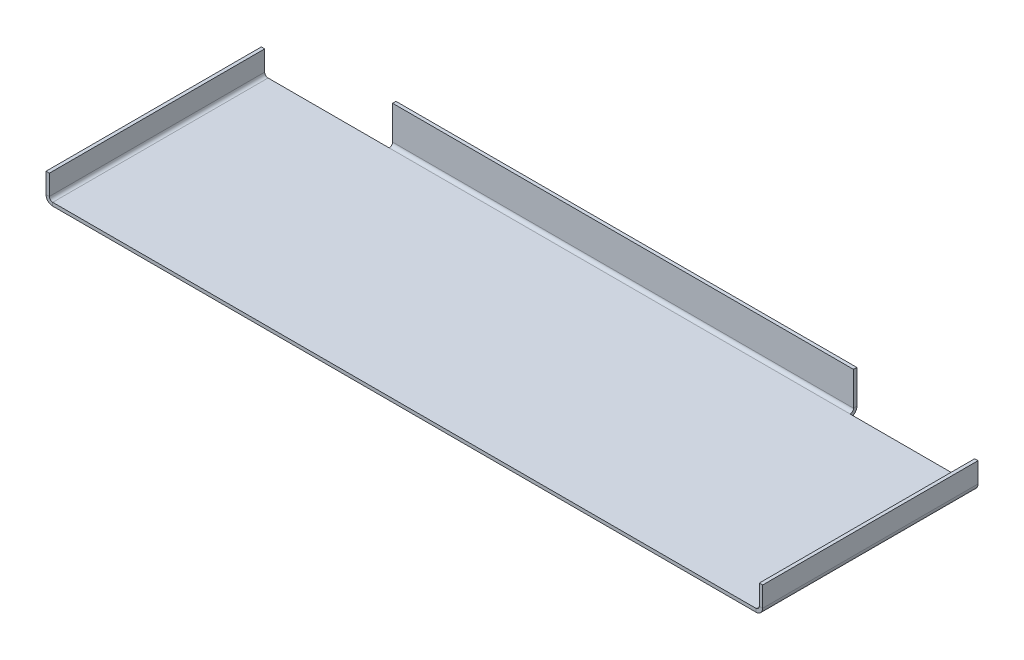
ISO-10303-21;
HEADER;
FILE_DESCRIPTION(('STEP AP214'),'2;1');
FILE_NAME('part.step','',(''),(''),'','','');
FILE_SCHEMA(('AUTOMOTIVE_DESIGN { 1 0 10303 214 1 1 1 1 }'));
ENDSEC;
DATA;
#1=APPLICATION_CONTEXT('core data for automotive mechanical design processes');
#2=APPLICATION_PROTOCOL_DEFINITION('international standard','automotive_design',2000,#1);
#3=PRODUCT_CONTEXT('',#1,'mechanical');
#4=PRODUCT('Part','Part','',(#3));
#5=PRODUCT_RELATED_PRODUCT_CATEGORY('part','',(#4));
#6=PRODUCT_DEFINITION_FORMATION('','',#4);
#7=PRODUCT_DEFINITION_CONTEXT('part definition',#1,'design');
#8=PRODUCT_DEFINITION('design','',#6,#7);
#9=PRODUCT_DEFINITION_SHAPE('','',#8);
#10=(LENGTH_UNIT() NAMED_UNIT(*) SI_UNIT(.MILLI.,.METRE.));
#11=(NAMED_UNIT(*) PLANE_ANGLE_UNIT() SI_UNIT($,.RADIAN.));
#12=(NAMED_UNIT(*) SI_UNIT($,.STERADIAN.) SOLID_ANGLE_UNIT());
#13=UNCERTAINTY_MEASURE_WITH_UNIT(LENGTH_MEASURE(1.E-05),#10,'distance_accuracy_value','');
#14=(GEOMETRIC_REPRESENTATION_CONTEXT(3) GLOBAL_UNCERTAINTY_ASSIGNED_CONTEXT((#13)) GLOBAL_UNIT_ASSIGNED_CONTEXT((#10,
#11,#12)) REPRESENTATION_CONTEXT('',''));
#15=CARTESIAN_POINT('',(0.,0.,0.));
#16=DIRECTION('',(0.,0.,1.));
#17=DIRECTION('',(1.,0.,0.));
#18=AXIS2_PLACEMENT_3D('',#15,#16,#17);
#19=CARTESIAN_POINT('',(0.,-3.175,-203.2));
#20=DIRECTION('',(0.,0.,-1.));
#21=DIRECTION('',(-1.,0.,0.));
#22=AXIS2_PLACEMENT_3D('',#19,#20,#21);
#23=PLANE('',#22);
#24=DIRECTION('',(-1.,0.,0.));
#25=VECTOR('',#24,1.);
#26=CARTESIAN_POINT('',(0.,0.,-203.2));
#27=LINE('',#26,#25);
#28=CARTESIAN_POINT('',(120.649999999983,0.,-203.2));
#29=VERTEX_POINT('',#28);
#30=CARTESIAN_POINT('',(6.34999999999993,0.,-203.2));
#31=VERTEX_POINT('',#30);
#32=EDGE_CURVE('E394',#29,#31,#27,.T.);
#33=ORIENTED_EDGE('',*,*,#32,.F.);
#34=DIRECTION('',(0.,-1.,0.));
#35=VECTOR('',#34,1.);
#36=CARTESIAN_POINT('',(120.649999999983,0.,-203.2));
#37=LINE('',#36,#35);
#38=CARTESIAN_POINT('',(120.649999999983,-3.175,-203.2));
#39=VERTEX_POINT('',#38);
#40=EDGE_CURVE('E271',#29,#39,#37,.T.);
#41=ORIENTED_EDGE('',*,*,#40,.T.);
#42=DIRECTION('',(-1.,0.,0.));
#43=VECTOR('',#42,1.);
#44=CARTESIAN_POINT('',(0.,-3.175,-203.2));
#45=LINE('',#44,#43);
#46=CARTESIAN_POINT('',(6.34999999999993,-3.175,-203.2));
#47=VERTEX_POINT('',#46);
#48=EDGE_CURVE('E106',#39,#47,#45,.T.);
#49=ORIENTED_EDGE('',*,*,#48,.T.);
#50=DIRECTION('',(0.,-1.,0.));
#51=VECTOR('',#50,1.);
#52=CARTESIAN_POINT('',(6.34999999999993,0.,-203.2));
#53=LINE('',#52,#51);
#54=EDGE_CURVE('E335',#31,#47,#53,.T.);
#55=ORIENTED_EDGE('',*,*,#54,.F.);
#56=EDGE_LOOP('',(#33,#41,#49,#55));
#57=FACE_BOUND('',#56,.T.);
#58=ADVANCED_FACE('F97',(#57),#23,.T.);
#59=CARTESIAN_POINT('',(0.,-3.175,0.));
#60=DIRECTION('',(0.,-1.,0.));
#61=DIRECTION('',(0.,0.,-1.));
#62=AXIS2_PLACEMENT_3D('',#59,#60,#61);
#63=PLANE('',#62);
#64=DIRECTION('',(1.,0.,0.));
#65=VECTOR('',#64,1.);
#66=CARTESIAN_POINT('',(0.,-3.175,0.));
#67=LINE('',#66,#65);
#68=CARTESIAN_POINT('',(6.34999999999998,-3.17499999999999,0.));
#69=VERTEX_POINT('',#68);
#70=CARTESIAN_POINT('',(669.935159999983,-3.175,0.));
#71=VERTEX_POINT('',#70);
#72=EDGE_CURVE('E391',#69,#71,#67,.T.);
#73=ORIENTED_EDGE('',*,*,#72,.F.);
#74=DIRECTION('',(0.,0.,1.));
#75=VECTOR('',#74,1.);
#76=CARTESIAN_POINT('',(6.34999999999998,-3.17499999999999,0.));
#77=LINE('',#76,#75);
#78=EDGE_CURVE('E317',#69,#47,#77,.F.);
#79=ORIENTED_EDGE('',*,*,#78,.T.);
#80=ORIENTED_EDGE('',*,*,#48,.F.);
#81=DIRECTION('',(-1.,0.,0.));
#82=VECTOR('',#81,1.);
#83=CARTESIAN_POINT('',(120.649999999983,-3.17499999999991,-203.2));
#84=LINE('',#83,#82);
#85=CARTESIAN_POINT('',(555.63516,-3.175,-203.2));
#86=VERTEX_POINT('',#85);
#87=EDGE_CURVE('E265',#39,#86,#84,.F.);
#88=ORIENTED_EDGE('',*,*,#87,.T.);
#89=CARTESIAN_POINT('',(669.935159999983,-3.17499999999998,-203.2));
#90=VERTEX_POINT('',#89);
#91=EDGE_CURVE('E13',#90,#86,#45,.T.);
#92=ORIENTED_EDGE('',*,*,#91,.F.);
#93=DIRECTION('',(0.,0.,-1.));
#94=VECTOR('',#93,1.);
#95=CARTESIAN_POINT('',(669.935159999983,-3.17499999999998,-203.2));
#96=LINE('',#95,#94);
#97=EDGE_CURVE('E371',#90,#71,#96,.F.);
#98=ORIENTED_EDGE('',*,*,#97,.T.);
#99=EDGE_LOOP('',(#73,#79,#80,#88,#92,#98));
#100=FACE_BOUND('',#99,.T.);
#101=ADVANCED_FACE('F418',(#100),#63,.T.);
#102=CARTESIAN_POINT('',(0.,0.,0.));
#103=DIRECTION('',(0.,-1.,0.));
#104=DIRECTION('',(0.,0.,-1.));
#105=AXIS2_PLACEMENT_3D('',#102,#103,#104);
#106=PLANE('',#105);
#107=DIRECTION('',(0.,0.,1.));
#108=VECTOR('',#107,1.);
#109=CARTESIAN_POINT('',(6.34999999999999,0.,0.));
#110=LINE('',#109,#108);
#111=CARTESIAN_POINT('',(6.34999999999999,0.,0.));
#112=VERTEX_POINT('',#111);
#113=EDGE_CURVE('E330',#112,#31,#110,.F.);
#114=ORIENTED_EDGE('',*,*,#113,.F.);
#115=DIRECTION('',(1.,0.,0.));
#116=VECTOR('',#115,1.);
#117=CARTESIAN_POINT('',(0.,0.,0.));
#118=LINE('',#117,#116);
#119=CARTESIAN_POINT('',(669.935159999983,0.,0.));
#120=VERTEX_POINT('',#119);
#121=EDGE_CURVE('E388',#112,#120,#118,.T.);
#122=ORIENTED_EDGE('',*,*,#121,.T.);
#123=DIRECTION('',(0.,0.,-1.));
#124=VECTOR('',#123,1.);
#125=CARTESIAN_POINT('',(669.935159999983,0.,-203.2));
#126=LINE('',#125,#124);
#127=CARTESIAN_POINT('',(669.935159999983,0.,-203.2));
#128=VERTEX_POINT('',#127);
#129=EDGE_CURVE('E382',#128,#120,#126,.F.);
#130=ORIENTED_EDGE('',*,*,#129,.F.);
#131=CARTESIAN_POINT('',(555.63516,0.,-203.2));
#132=VERTEX_POINT('',#131);
#133=EDGE_CURVE('E101',#128,#132,#27,.T.);
#134=ORIENTED_EDGE('',*,*,#133,.T.);
#135=DIRECTION('',(-1.,0.,0.));
#136=VECTOR('',#135,1.);
#137=CARTESIAN_POINT('',(120.649999999983,0.,-203.2));
#138=LINE('',#137,#136);
#139=EDGE_CURVE('E276',#29,#132,#138,.F.);
#140=ORIENTED_EDGE('',*,*,#139,.F.);
#141=ORIENTED_EDGE('',*,*,#32,.T.);
#142=EDGE_LOOP('',(#114,#122,#130,#134,#140,#141));
#143=FACE_BOUND('',#142,.T.);
#144=ADVANCED_FACE('F404',(#143),#106,.F.);
#145=CARTESIAN_POINT('',(0.,-3.175,0.));
#146=DIRECTION('',(0.,0.,1.));
#147=DIRECTION('',(1.,0.,0.));
#148=AXIS2_PLACEMENT_3D('',#145,#146,#147);
#149=PLANE('',#148);
#150=ORIENTED_EDGE('',*,*,#121,.F.);
#151=DIRECTION('',(0.,-1.,0.));
#152=VECTOR('',#151,1.);
#153=CARTESIAN_POINT('',(6.34999999999999,0.,0.));
#154=LINE('',#153,#152);
#155=EDGE_CURVE('E324',#112,#69,#154,.T.);
#156=ORIENTED_EDGE('',*,*,#155,.T.);
#157=ORIENTED_EDGE('',*,*,#72,.T.);
#158=DIRECTION('',(0.,-1.,0.));
#159=VECTOR('',#158,1.);
#160=CARTESIAN_POINT('',(669.935159999983,0.,0.));
#161=LINE('',#160,#159);
#162=EDGE_CURVE('E386',#120,#71,#161,.T.);
#163=ORIENTED_EDGE('',*,*,#162,.F.);
#164=EDGE_LOOP('',(#150,#156,#157,#163));
#165=FACE_BOUND('',#164,.T.);
#166=ADVANCED_FACE('F99',(#165),#149,.T.);
#167=DIRECTION('',(0.,-1.,0.));
#168=VECTOR('',#167,1.);
#169=CARTESIAN_POINT('',(555.63516,0.,-203.2));
#170=LINE('',#169,#168);
#171=EDGE_CURVE('E281',#132,#86,#170,.T.);
#172=ORIENTED_EDGE('',*,*,#171,.F.);
#173=ORIENTED_EDGE('',*,*,#133,.F.);
#174=DIRECTION('',(0.,-1.,0.));
#175=VECTOR('',#174,1.);
#176=CARTESIAN_POINT('',(669.935159999983,0.,-203.2));
#177=LINE('',#176,#175);
#178=EDGE_CURVE('E376',#128,#90,#177,.T.);
#179=ORIENTED_EDGE('',*,*,#178,.T.);
#180=ORIENTED_EDGE('',*,*,#91,.T.);
#181=EDGE_LOOP('',(#172,#173,#179,#180));
#182=FACE_BOUND('',#181,.T.);
#183=ADVANCED_FACE('F407',(#182),#23,.T.);
#184=CARTESIAN_POINT('',(669.935159999983,3.17500000000005,0.));
#185=DIRECTION('',(0.,0.,1.));
#186=DIRECTION('',(1.,0.,0.));
#187=AXIS2_PLACEMENT_3D('',#184,#185,#186);
#188=PLANE('',#187);
#189=DIRECTION('',(-1.,0.,0.));
#190=VECTOR('',#189,1.);
#191=CARTESIAN_POINT('',(676.285159999983,3.17500000000002,0.));
#192=LINE('',#191,#190);
#193=CARTESIAN_POINT('',(673.110159999983,3.17500000000004,0.));
#194=VERTEX_POINT('',#193);
#195=CARTESIAN_POINT('',(676.285159999983,3.17500000000002,0.));
#196=VERTEX_POINT('',#195);
#197=EDGE_CURVE('E338',#194,#196,#192,.F.);
#198=ORIENTED_EDGE('',*,*,#197,.F.);
#199=CARTESIAN_POINT('',(669.935159999983,3.17500000000005,0.));
#200=DIRECTION('',(0.,0.,-1.));
#201=DIRECTION('',(-1.,0.,0.));
#202=AXIS2_PLACEMENT_3D('',#199,#200,#201);
#203=CIRCLE('',#202,3.17500000000004);
#204=EDGE_CURVE('E379',#120,#194,#203,.F.);
#205=ORIENTED_EDGE('',*,*,#204,.F.);
#206=ORIENTED_EDGE('',*,*,#162,.T.);
#207=CARTESIAN_POINT('',(669.935159999983,3.17500000000005,0.));
#208=DIRECTION('',(0.,0.,-1.));
#209=DIRECTION('',(-1.,0.,0.));
#210=AXIS2_PLACEMENT_3D('',#207,#208,#209);
#211=CIRCLE('',#210,6.35000000000004);
#212=EDGE_CURVE('E122',#71,#196,#211,.F.);
#213=ORIENTED_EDGE('',*,*,#212,.T.);
#214=EDGE_LOOP('',(#198,#205,#206,#213));
#215=FACE_BOUND('',#214,.T.);
#216=ADVANCED_FACE('F468',(#215),#188,.T.);
#217=CARTESIAN_POINT('',(669.935159999983,3.17500000000005,-203.2));
#218=DIRECTION('',(0.,0.,1.));
#219=DIRECTION('',(1.,0.,0.));
#220=AXIS2_PLACEMENT_3D('',#217,#218,#219);
#221=PLANE('',#220);
#222=CARTESIAN_POINT('',(669.935159999983,3.17500000000005,-203.2));
#223=DIRECTION('',(0.,0.,-1.));
#224=DIRECTION('',(-1.,0.,0.));
#225=AXIS2_PLACEMENT_3D('',#222,#223,#224);
#226=CIRCLE('',#225,3.17500000000004);
#227=CARTESIAN_POINT('',(673.110159999983,3.17500000000004,-203.2));
#228=VERTEX_POINT('',#227);
#229=EDGE_CURVE('E344',#228,#128,#226,.T.);
#230=ORIENTED_EDGE('',*,*,#229,.F.);
#231=DIRECTION('',(-1.,0.,0.));
#232=VECTOR('',#231,1.);
#233=CARTESIAN_POINT('',(673.110159999983,3.17500000000004,-203.2));
#234=LINE('',#233,#232);
#235=CARTESIAN_POINT('',(676.285159999983,3.17500000000002,-203.2));
#236=VERTEX_POINT('',#235);
#237=EDGE_CURVE('E364',#228,#236,#234,.F.);
#238=ORIENTED_EDGE('',*,*,#237,.T.);
#239=CARTESIAN_POINT('',(669.935159999983,3.17500000000005,-203.2));
#240=DIRECTION('',(0.,0.,-1.));
#241=DIRECTION('',(-1.,0.,0.));
#242=AXIS2_PLACEMENT_3D('',#239,#240,#241);
#243=CIRCLE('',#242,6.35000000000004);
#244=EDGE_CURVE('E374',#236,#90,#243,.T.);
#245=ORIENTED_EDGE('',*,*,#244,.T.);
#246=ORIENTED_EDGE('',*,*,#178,.F.);
#247=EDGE_LOOP('',(#230,#238,#245,#246));
#248=FACE_BOUND('',#247,.T.);
#249=ADVANCED_FACE('F473',(#248),#221,.F.);
#250=CARTESIAN_POINT('',(669.935159999983,3.17500000000005,-203.2));
#251=DIRECTION('',(0.,0.,-1.));
#252=DIRECTION('',(1.,0.,0.));
#253=AXIS2_PLACEMENT_3D('',#250,#251,#252);
#254=CYLINDRICAL_SURFACE('',#253,6.35000000000004);
#255=ORIENTED_EDGE('',*,*,#97,.F.);
#256=ORIENTED_EDGE('',*,*,#244,.F.);
#257=DIRECTION('',(0.,0.,-1.));
#258=VECTOR('',#257,1.);
#259=CARTESIAN_POINT('',(676.285159999983,3.17500000000002,0.));
#260=LINE('',#259,#258);
#261=EDGE_CURVE('E362',#236,#196,#260,.F.);
#262=ORIENTED_EDGE('',*,*,#261,.T.);
#263=ORIENTED_EDGE('',*,*,#212,.F.);
#264=EDGE_LOOP('',(#255,#256,#262,#263));
#265=FACE_BOUND('',#264,.T.);
#266=ADVANCED_FACE('F506',(#265),#254,.T.);
#267=CARTESIAN_POINT('',(669.935159999983,3.17500000000005,-203.2));
#268=DIRECTION('',(0.,0.,-1.));
#269=DIRECTION('',(1.,0.,0.));
#270=AXIS2_PLACEMENT_3D('',#267,#268,#269);
#271=CYLINDRICAL_SURFACE('',#270,3.17500000000004);
#272=ORIENTED_EDGE('',*,*,#129,.T.);
#273=ORIENTED_EDGE('',*,*,#204,.T.);
#274=DIRECTION('',(0.,0.,-1.));
#275=VECTOR('',#274,1.);
#276=CARTESIAN_POINT('',(673.110159999983,3.17500000000004,0.));
#277=LINE('',#276,#275);
#278=EDGE_CURVE('E367',#194,#228,#277,.T.);
#279=ORIENTED_EDGE('',*,*,#278,.T.);
#280=ORIENTED_EDGE('',*,*,#229,.T.);
#281=EDGE_LOOP('',(#272,#273,#279,#280));
#282=FACE_BOUND('',#281,.T.);
#283=ADVANCED_FACE('F483',(#282),#271,.F.);
#284=CARTESIAN_POINT('',(676.285159999983,22.225,-203.2));
#285=DIRECTION('',(0.,0.,1.));
#286=DIRECTION('',(1.,0.,0.));
#287=AXIS2_PLACEMENT_3D('',#284,#285,#286);
#288=PLANE('',#287);
#289=ORIENTED_EDGE('',*,*,#237,.F.);
#290=DIRECTION('',(0.,-1.,0.));
#291=VECTOR('',#290,1.);
#292=CARTESIAN_POINT('',(673.110159999983,22.225,-203.2));
#293=LINE('',#292,#291);
#294=CARTESIAN_POINT('',(673.110159999983,22.225,-203.2));
#295=VERTEX_POINT('',#294);
#296=EDGE_CURVE('E360',#228,#295,#293,.F.);
#297=ORIENTED_EDGE('',*,*,#296,.T.);
#298=DIRECTION('',(-1.,0.,0.));
#299=VECTOR('',#298,1.);
#300=CARTESIAN_POINT('',(676.285159999983,22.225,-203.2));
#301=LINE('',#300,#299);
#302=CARTESIAN_POINT('',(676.285159999983,22.225,-203.2));
#303=VERTEX_POINT('',#302);
#304=EDGE_CURVE('E341',#303,#295,#301,.T.);
#305=ORIENTED_EDGE('',*,*,#304,.F.);
#306=DIRECTION('',(0.,1.,0.));
#307=VECTOR('',#306,1.);
#308=CARTESIAN_POINT('',(676.285159999983,-3.38938626694841E-12,-203.2));
#309=LINE('',#308,#307);
#310=EDGE_CURVE('E353',#236,#303,#309,.T.);
#311=ORIENTED_EDGE('',*,*,#310,.F.);
#312=EDGE_LOOP('',(#289,#297,#305,#311));
#313=FACE_BOUND('',#312,.T.);
#314=ADVANCED_FACE('F501',(#313),#288,.F.);
#315=CARTESIAN_POINT('',(676.285159999983,0.,0.));
#316=DIRECTION('',(0.,0.,-1.));
#317=DIRECTION('',(-1.,0.,0.));
#318=AXIS2_PLACEMENT_3D('',#315,#316,#317);
#319=PLANE('',#318);
#320=ORIENTED_EDGE('',*,*,#197,.T.);
#321=DIRECTION('',(0.,-1.,0.));
#322=VECTOR('',#321,1.);
#323=CARTESIAN_POINT('',(676.285159999983,-3.38938626694841E-12,0.));
#324=LINE('',#323,#322);
#325=CARTESIAN_POINT('',(676.285159999983,22.225,0.));
#326=VERTEX_POINT('',#325);
#327=EDGE_CURVE('E348',#326,#196,#324,.T.);
#328=ORIENTED_EDGE('',*,*,#327,.F.);
#329=DIRECTION('',(-1.,0.,0.));
#330=VECTOR('',#329,1.);
#331=CARTESIAN_POINT('',(676.285159999983,22.225,0.));
#332=LINE('',#331,#330);
#333=CARTESIAN_POINT('',(673.110159999983,22.225,0.));
#334=VERTEX_POINT('',#333);
#335=EDGE_CURVE('E345',#326,#334,#332,.T.);
#336=ORIENTED_EDGE('',*,*,#335,.T.);
#337=DIRECTION('',(0.,1.,0.));
#338=VECTOR('',#337,1.);
#339=CARTESIAN_POINT('',(673.110159999983,0.,0.));
#340=LINE('',#339,#338);
#341=EDGE_CURVE('E355',#334,#194,#340,.F.);
#342=ORIENTED_EDGE('',*,*,#341,.T.);
#343=EDGE_LOOP('',(#320,#328,#336,#342));
#344=FACE_BOUND('',#343,.T.);
#345=ADVANCED_FACE('F491',(#344),#319,.F.);
#346=CARTESIAN_POINT('',(676.285159999983,-3.38938626694841E-12,0.));
#347=DIRECTION('',(-1.,0.,0.));
#348=DIRECTION('',(0.,-1.,0.));
#349=AXIS2_PLACEMENT_3D('',#346,#347,#348);
#350=PLANE('',#349);
#351=ORIENTED_EDGE('',*,*,#261,.F.);
#352=ORIENTED_EDGE('',*,*,#310,.T.);
#353=DIRECTION('',(0.,0.,1.));
#354=VECTOR('',#353,1.);
#355=CARTESIAN_POINT('',(676.285159999983,22.225,0.));
#356=LINE('',#355,#354);
#357=EDGE_CURVE('E351',#303,#326,#356,.T.);
#358=ORIENTED_EDGE('',*,*,#357,.T.);
#359=ORIENTED_EDGE('',*,*,#327,.T.);
#360=EDGE_LOOP('',(#351,#352,#358,#359));
#361=FACE_BOUND('',#360,.T.);
#362=ADVANCED_FACE('F505',(#361),#350,.F.);
#363=CARTESIAN_POINT('',(673.110159999983,-3.37830081369759E-12,0.));
#364=DIRECTION('',(-1.,0.,0.));
#365=DIRECTION('',(0.,-1.,0.));
#366=AXIS2_PLACEMENT_3D('',#363,#364,#365);
#367=PLANE('',#366);
#368=ORIENTED_EDGE('',*,*,#296,.F.);
#369=ORIENTED_EDGE('',*,*,#278,.F.);
#370=ORIENTED_EDGE('',*,*,#341,.F.);
#371=DIRECTION('',(0.,0.,-1.));
#372=VECTOR('',#371,1.);
#373=CARTESIAN_POINT('',(673.110159999983,22.225,0.));
#374=LINE('',#373,#372);
#375=EDGE_CURVE('E358',#295,#334,#374,.F.);
#376=ORIENTED_EDGE('',*,*,#375,.F.);
#377=EDGE_LOOP('',(#368,#369,#370,#376));
#378=FACE_BOUND('',#377,.T.);
#379=ADVANCED_FACE('F488',(#378),#367,.T.);
#380=CARTESIAN_POINT('',(676.285159999983,22.225,0.));
#381=DIRECTION('',(0.,-1.,0.));
#382=DIRECTION('',(1.,0.,0.));
#383=AXIS2_PLACEMENT_3D('',#380,#381,#382);
#384=PLANE('',#383);
#385=ORIENTED_EDGE('',*,*,#375,.T.);
#386=ORIENTED_EDGE('',*,*,#335,.F.);
#387=ORIENTED_EDGE('',*,*,#357,.F.);
#388=ORIENTED_EDGE('',*,*,#304,.T.);
#389=EDGE_LOOP('',(#385,#386,#387,#388));
#390=FACE_BOUND('',#389,.T.);
#391=ADVANCED_FACE('F496',(#390),#384,.F.);
#392=CARTESIAN_POINT('',(6.34999999999994,3.175,-203.2));
#393=DIRECTION('',(0.,0.,-1.));
#394=DIRECTION('',(-1.,0.,0.));
#395=AXIS2_PLACEMENT_3D('',#392,#393,#394);
#396=PLANE('',#395);
#397=DIRECTION('',(1.,0.,0.));
#398=VECTOR('',#397,1.);
#399=CARTESIAN_POINT('',(0.,3.17499999999998,-203.2));
#400=LINE('',#399,#398);
#401=CARTESIAN_POINT('',(3.17499999999995,3.17499999999999,-203.2));
#402=VERTEX_POINT('',#401);
#403=CARTESIAN_POINT('',(0.,3.17499999999998,-203.2));
#404=VERTEX_POINT('',#403);
#405=EDGE_CURVE('E283',#402,#404,#400,.F.);
#406=ORIENTED_EDGE('',*,*,#405,.F.);
#407=CARTESIAN_POINT('',(6.34999999999994,3.175,-203.2));
#408=DIRECTION('',(0.,0.,1.));
#409=DIRECTION('',(1.,0.,0.));
#410=AXIS2_PLACEMENT_3D('',#407,#408,#409);
#411=CIRCLE('',#410,3.17499999999999);
#412=EDGE_CURVE('E327',#31,#402,#411,.F.);
#413=ORIENTED_EDGE('',*,*,#412,.F.);
#414=ORIENTED_EDGE('',*,*,#54,.T.);
#415=CARTESIAN_POINT('',(6.34999999999994,3.175,-203.2));
#416=DIRECTION('',(0.,0.,1.));
#417=DIRECTION('',(1.,0.,0.));
#418=AXIS2_PLACEMENT_3D('',#415,#416,#417);
#419=CIRCLE('',#418,6.34999999999999);
#420=EDGE_CURVE('E320',#47,#404,#419,.F.);
#421=ORIENTED_EDGE('',*,*,#420,.T.);
#422=EDGE_LOOP('',(#406,#413,#414,#421));
#423=FACE_BOUND('',#422,.T.);
#424=ADVANCED_FACE('F426',(#423),#396,.T.);
#425=CARTESIAN_POINT('',(6.35,3.175,0.));
#426=DIRECTION('',(0.,0.,-1.));
#427=DIRECTION('',(-1.,0.,0.));
#428=AXIS2_PLACEMENT_3D('',#425,#426,#427);
#429=PLANE('',#428);
#430=CARTESIAN_POINT('',(6.35,3.175,0.));
#431=DIRECTION('',(0.,0.,1.));
#432=DIRECTION('',(1.,0.,0.));
#433=AXIS2_PLACEMENT_3D('',#430,#431,#432);
#434=CIRCLE('',#433,3.17499999999999);
#435=CARTESIAN_POINT('',(3.17500000000001,3.17499999999999,0.));
#436=VERTEX_POINT('',#435);
#437=EDGE_CURVE('E289',#436,#112,#434,.T.);
#438=ORIENTED_EDGE('',*,*,#437,.F.);
#439=DIRECTION('',(1.,0.,0.));
#440=VECTOR('',#439,1.);
#441=CARTESIAN_POINT('',(3.17499999999999,3.17499999999999,0.));
#442=LINE('',#441,#440);
#443=CARTESIAN_POINT('',(0.,3.17499999999998,0.));
#444=VERTEX_POINT('',#443);
#445=EDGE_CURVE('E310',#436,#444,#442,.F.);
#446=ORIENTED_EDGE('',*,*,#445,.T.);
#447=CARTESIAN_POINT('',(6.35,3.175,0.));
#448=DIRECTION('',(0.,0.,1.));
#449=DIRECTION('',(1.,0.,0.));
#450=AXIS2_PLACEMENT_3D('',#447,#448,#449);
#451=CIRCLE('',#450,6.34999999999999);
#452=EDGE_CURVE('E321',#444,#69,#451,.T.);
#453=ORIENTED_EDGE('',*,*,#452,.T.);
#454=ORIENTED_EDGE('',*,*,#155,.F.);
#455=EDGE_LOOP('',(#438,#446,#453,#454));
#456=FACE_BOUND('',#455,.T.);
#457=ADVANCED_FACE('F449',(#456),#429,.F.);
#458=CARTESIAN_POINT('',(6.35,3.175,0.));
#459=DIRECTION('',(0.,0.,1.));
#460=DIRECTION('',(-1.,0.,0.));
#461=AXIS2_PLACEMENT_3D('',#458,#459,#460);
#462=CYLINDRICAL_SURFACE('',#461,6.34999999999999);
#463=ORIENTED_EDGE('',*,*,#78,.F.);
#464=ORIENTED_EDGE('',*,*,#452,.F.);
#465=DIRECTION('',(0.,0.,1.));
#466=VECTOR('',#465,1.);
#467=CARTESIAN_POINT('',(0.,3.17499999999998,0.));
#468=LINE('',#467,#466);
#469=EDGE_CURVE('E307',#404,#444,#468,.T.);
#470=ORIENTED_EDGE('',*,*,#469,.F.);
#471=ORIENTED_EDGE('',*,*,#420,.F.);
#472=EDGE_LOOP('',(#463,#464,#470,#471));
#473=FACE_BOUND('',#472,.T.);
#474=ADVANCED_FACE('F423',(#473),#462,.T.);
#475=CARTESIAN_POINT('',(6.35,3.175,0.));
#476=DIRECTION('',(0.,0.,1.));
#477=DIRECTION('',(-1.,0.,0.));
#478=AXIS2_PLACEMENT_3D('',#475,#476,#477);
#479=CYLINDRICAL_SURFACE('',#478,3.17499999999999);
#480=ORIENTED_EDGE('',*,*,#113,.T.);
#481=ORIENTED_EDGE('',*,*,#412,.T.);
#482=DIRECTION('',(0.,0.,-1.));
#483=VECTOR('',#482,1.);
#484=CARTESIAN_POINT('',(3.17499999999995,3.17499999999999,-203.2));
#485=LINE('',#484,#483);
#486=EDGE_CURVE('E313',#402,#436,#485,.F.);
#487=ORIENTED_EDGE('',*,*,#486,.T.);
#488=ORIENTED_EDGE('',*,*,#437,.T.);
#489=EDGE_LOOP('',(#480,#481,#487,#488));
#490=FACE_BOUND('',#489,.T.);
#491=ADVANCED_FACE('F429',(#490),#479,.F.);
#492=CARTESIAN_POINT('',(0.,0.,0.));
#493=DIRECTION('',(0.,0.,-1.));
#494=DIRECTION('',(-1.,0.,0.));
#495=AXIS2_PLACEMENT_3D('',#492,#493,#494);
#496=PLANE('',#495);
#497=ORIENTED_EDGE('',*,*,#445,.F.);
#498=DIRECTION('',(0.,1.,0.));
#499=VECTOR('',#498,1.);
#500=CARTESIAN_POINT('',(3.175,0.,0.));
#501=LINE('',#500,#499);
#502=CARTESIAN_POINT('',(3.17499999999992,22.225,0.));
#503=VERTEX_POINT('',#502);
#504=EDGE_CURVE('E305',#436,#503,#501,.T.);
#505=ORIENTED_EDGE('',*,*,#504,.T.);
#506=DIRECTION('',(1.,0.,0.));
#507=VECTOR('',#506,1.);
#508=CARTESIAN_POINT('',(0.,22.225,0.));
#509=LINE('',#508,#507);
#510=CARTESIAN_POINT('',(0.,22.225,0.));
#511=VERTEX_POINT('',#510);
#512=EDGE_CURVE('E286',#511,#503,#509,.T.);
#513=ORIENTED_EDGE('',*,*,#512,.F.);
#514=DIRECTION('',(0.,-1.,0.));
#515=VECTOR('',#514,1.);
#516=CARTESIAN_POINT('',(0.,0.,0.));
#517=LINE('',#516,#515);
#518=EDGE_CURVE('E298',#444,#511,#517,.F.);
#519=ORIENTED_EDGE('',*,*,#518,.F.);
#520=EDGE_LOOP('',(#497,#505,#513,#519));
#521=FACE_BOUND('',#520,.T.);
#522=ADVANCED_FACE('F447',(#521),#496,.F.);
#523=CARTESIAN_POINT('',(-1.14925430283463E-13,22.225,-203.2));
#524=DIRECTION('',(0.,0.,1.));
#525=DIRECTION('',(1.,0.,0.));
#526=AXIS2_PLACEMENT_3D('',#523,#524,#525);
#527=PLANE('',#526);
#528=ORIENTED_EDGE('',*,*,#405,.T.);
#529=DIRECTION('',(0.,1.,0.));
#530=VECTOR('',#529,1.);
#531=CARTESIAN_POINT('',(0.,0.,-203.2));
#532=LINE('',#531,#530);
#533=CARTESIAN_POINT('',(-1.149254071938E-13,22.225,-203.2));
#534=VERTEX_POINT('',#533);
#535=EDGE_CURVE('E293',#534,#404,#532,.F.);
#536=ORIENTED_EDGE('',*,*,#535,.F.);
#537=DIRECTION('',(1.,0.,0.));
#538=VECTOR('',#537,1.);
#539=CARTESIAN_POINT('',(-1.14925430283463E-13,22.225,-203.2));
#540=LINE('',#539,#538);
#541=CARTESIAN_POINT('',(3.17499999999988,22.225,-203.2));
#542=VERTEX_POINT('',#541);
#543=EDGE_CURVE('E290',#534,#542,#540,.T.);
#544=ORIENTED_EDGE('',*,*,#543,.T.);
#545=DIRECTION('',(0.,-1.,0.));
#546=VECTOR('',#545,1.);
#547=CARTESIAN_POINT('',(3.17499999999988,22.225,-203.2));
#548=LINE('',#547,#546);
#549=EDGE_CURVE('E300',#542,#402,#548,.T.);
#550=ORIENTED_EDGE('',*,*,#549,.T.);
#551=EDGE_LOOP('',(#528,#536,#544,#550));
#552=FACE_BOUND('',#551,.T.);
#553=ADVANCED_FACE('F438',(#552),#527,.F.);
#554=CARTESIAN_POINT('',(0.,0.,0.));
#555=DIRECTION('',(-1.,0.,0.));
#556=DIRECTION('',(0.,-1.,0.));
#557=AXIS2_PLACEMENT_3D('',#554,#555,#556);
#558=PLANE('',#557);
#559=ORIENTED_EDGE('',*,*,#535,.T.);
#560=ORIENTED_EDGE('',*,*,#469,.T.);
#561=ORIENTED_EDGE('',*,*,#518,.T.);
#562=DIRECTION('',(0.,0.,1.));
#563=VECTOR('',#562,1.);
#564=CARTESIAN_POINT('',(0.,22.225,0.));
#565=LINE('',#564,#563);
#566=EDGE_CURVE('E296',#511,#534,#565,.F.);
#567=ORIENTED_EDGE('',*,*,#566,.T.);
#568=EDGE_LOOP('',(#559,#560,#561,#567));
#569=FACE_BOUND('',#568,.T.);
#570=ADVANCED_FACE('F451',(#569),#558,.T.);
#571=CARTESIAN_POINT('',(3.175,0.,0.));
#572=DIRECTION('',(-1.,0.,0.));
#573=DIRECTION('',(0.,-1.,0.));
#574=AXIS2_PLACEMENT_3D('',#571,#572,#573);
#575=PLANE('',#574);
#576=ORIENTED_EDGE('',*,*,#486,.F.);
#577=ORIENTED_EDGE('',*,*,#549,.F.);
#578=DIRECTION('',(0.,0.,-1.));
#579=VECTOR('',#578,1.);
#580=CARTESIAN_POINT('',(3.17499999999992,22.225,0.));
#581=LINE('',#580,#579);
#582=EDGE_CURVE('E303',#503,#542,#581,.T.);
#583=ORIENTED_EDGE('',*,*,#582,.F.);
#584=ORIENTED_EDGE('',*,*,#504,.F.);
#585=EDGE_LOOP('',(#576,#577,#583,#584));
#586=FACE_BOUND('',#585,.T.);
#587=ADVANCED_FACE('F434',(#586),#575,.F.);
#588=CARTESIAN_POINT('',(0.,22.225,0.));
#589=DIRECTION('',(0.,-1.,0.));
#590=DIRECTION('',(1.,0.,0.));
#591=AXIS2_PLACEMENT_3D('',#588,#589,#590);
#592=PLANE('',#591);
#593=ORIENTED_EDGE('',*,*,#582,.T.);
#594=ORIENTED_EDGE('',*,*,#543,.F.);
#595=ORIENTED_EDGE('',*,*,#566,.F.);
#596=ORIENTED_EDGE('',*,*,#512,.T.);
#597=EDGE_LOOP('',(#593,#594,#595,#596));
#598=FACE_BOUND('',#597,.T.);
#599=ADVANCED_FACE('F443',(#598),#592,.F.);
#600=CARTESIAN_POINT('',(555.63516,3.17499999999999,-203.2));
#601=DIRECTION('',(1.,0.,0.));
#602=DIRECTION('',(0.,1.,0.));
#603=AXIS2_PLACEMENT_3D('',#600,#601,#602);
#604=PLANE('',#603);
#605=DIRECTION('',(0.,0.,1.));
#606=VECTOR('',#605,1.);
#607=CARTESIAN_POINT('',(555.63516,3.17500000000003,-209.55));
#608=LINE('',#607,#606);
#609=CARTESIAN_POINT('',(555.63516,3.17499999999998,-206.375));
#610=VERTEX_POINT('',#609);
#611=CARTESIAN_POINT('',(555.63516,3.17499999999997,-209.55));
#612=VERTEX_POINT('',#611);
#613=EDGE_CURVE('E248',#610,#612,#608,.F.);
#614=ORIENTED_EDGE('',*,*,#613,.F.);
#615=CARTESIAN_POINT('',(555.63516,3.17499999999999,-203.2));
#616=DIRECTION('',(-1.,0.,0.));
#617=DIRECTION('',(0.,-1.,0.));
#618=AXIS2_PLACEMENT_3D('',#615,#616,#617);
#619=CIRCLE('',#618,3.17499999999998);
#620=EDGE_CURVE('E273',#132,#610,#619,.F.);
#621=ORIENTED_EDGE('',*,*,#620,.F.);
#622=ORIENTED_EDGE('',*,*,#171,.T.);
#623=CARTESIAN_POINT('',(555.63516,3.17499999999999,-203.2));
#624=DIRECTION('',(-1.,0.,0.));
#625=DIRECTION('',(0.,-1.,0.));
#626=AXIS2_PLACEMENT_3D('',#623,#624,#625);
#627=CIRCLE('',#626,6.34999999999998);
#628=EDGE_CURVE('E268',#86,#612,#627,.F.);
#629=ORIENTED_EDGE('',*,*,#628,.T.);
#630=EDGE_LOOP('',(#614,#621,#622,#629));
#631=FACE_BOUND('',#630,.T.);
#632=ADVANCED_FACE('F412',(#631),#604,.T.);
#633=CARTESIAN_POINT('',(120.649999999983,3.17500000000007,-203.2));
#634=DIRECTION('',(1.,0.,0.));
#635=DIRECTION('',(0.,1.,0.));
#636=AXIS2_PLACEMENT_3D('',#633,#634,#635);
#637=PLANE('',#636);
#638=CARTESIAN_POINT('',(120.649999999983,3.17500000000007,-203.2));
#639=DIRECTION('',(-1.,0.,0.));
#640=DIRECTION('',(0.,-1.,0.));
#641=AXIS2_PLACEMENT_3D('',#638,#639,#640);
#642=CIRCLE('',#641,3.17499999999998);
#643=CARTESIAN_POINT('',(120.649999999983,3.17500000000007,-206.375));
#644=VERTEX_POINT('',#643);
#645=EDGE_CURVE('E278',#644,#29,#642,.T.);
#646=ORIENTED_EDGE('',*,*,#645,.F.);
#647=DIRECTION('',(0.,0.,1.));
#648=VECTOR('',#647,1.);
#649=CARTESIAN_POINT('',(120.649999999983,3.17500000000009,-206.375));
#650=LINE('',#649,#648);
#651=CARTESIAN_POINT('',(120.649999999983,3.17500000000012,-209.55));
#652=VERTEX_POINT('',#651);
#653=EDGE_CURVE('E260',#644,#652,#650,.F.);
#654=ORIENTED_EDGE('',*,*,#653,.T.);
#655=CARTESIAN_POINT('',(120.649999999983,3.17500000000007,-203.2));
#656=DIRECTION('',(-1.,0.,0.));
#657=DIRECTION('',(0.,-1.,0.));
#658=AXIS2_PLACEMENT_3D('',#655,#656,#657);
#659=CIRCLE('',#658,6.34999999999998);
#660=EDGE_CURVE('E114',#652,#39,#659,.T.);
#661=ORIENTED_EDGE('',*,*,#660,.T.);
#662=ORIENTED_EDGE('',*,*,#40,.F.);
#663=EDGE_LOOP('',(#646,#654,#661,#662));
#664=FACE_BOUND('',#663,.T.);
#665=ADVANCED_FACE('F540',(#664),#637,.F.);
#666=CARTESIAN_POINT('',(120.649999999983,3.17500000000007,-203.2));
#667=DIRECTION('',(-1.,0.,0.));
#668=DIRECTION('',(0.,0.,-1.));
#669=AXIS2_PLACEMENT_3D('',#666,#667,#668);
#670=CYLINDRICAL_SURFACE('',#669,6.34999999999998);
#671=ORIENTED_EDGE('',*,*,#87,.F.);
#672=ORIENTED_EDGE('',*,*,#660,.F.);
#673=DIRECTION('',(-1.,0.,0.));
#674=VECTOR('',#673,1.);
#675=CARTESIAN_POINT('',(555.63516,3.17500000000003,-209.55));
#676=LINE('',#675,#674);
#677=EDGE_CURVE('E258',#652,#612,#676,.F.);
#678=ORIENTED_EDGE('',*,*,#677,.T.);
#679=ORIENTED_EDGE('',*,*,#628,.F.);
#680=EDGE_LOOP('',(#671,#672,#678,#679));
#681=FACE_BOUND('',#680,.T.);
#682=ADVANCED_FACE('F414',(#681),#670,.T.);
#683=CARTESIAN_POINT('',(120.649999999983,3.17500000000007,-203.2));
#684=DIRECTION('',(-1.,0.,0.));
#685=DIRECTION('',(0.,0.,-1.));
#686=AXIS2_PLACEMENT_3D('',#683,#684,#685);
#687=CYLINDRICAL_SURFACE('',#686,3.17499999999998);
#688=ORIENTED_EDGE('',*,*,#139,.T.);
#689=ORIENTED_EDGE('',*,*,#620,.T.);
#690=DIRECTION('',(-1.,0.,0.));
#691=VECTOR('',#690,1.);
#692=CARTESIAN_POINT('',(555.63516,3.17500000000001,-206.375));
#693=LINE('',#692,#691);
#694=EDGE_CURVE('E262',#610,#644,#693,.T.);
#695=ORIENTED_EDGE('',*,*,#694,.T.);
#696=ORIENTED_EDGE('',*,*,#645,.T.);
#697=EDGE_LOOP('',(#688,#689,#695,#696));
#698=FACE_BOUND('',#697,.T.);
#699=ADVANCED_FACE('F546',(#698),#687,.F.);
#700=CARTESIAN_POINT('',(120.649999999983,34.925,-209.55));
#701=DIRECTION('',(1.,0.,0.));
#702=DIRECTION('',(0.,0.,-1.));
#703=AXIS2_PLACEMENT_3D('',#700,#701,#702);
#704=PLANE('',#703);
#705=ORIENTED_EDGE('',*,*,#653,.F.);
#706=DIRECTION('',(0.,-1.,0.));
#707=VECTOR('',#706,1.);
#708=CARTESIAN_POINT('',(120.649999999983,34.925,-206.375));
#709=LINE('',#708,#707);
#710=CARTESIAN_POINT('',(120.649999999983,34.925,-206.375));
#711=VERTEX_POINT('',#710);
#712=EDGE_CURVE('E256',#644,#711,#709,.F.);
#713=ORIENTED_EDGE('',*,*,#712,.T.);
#714=DIRECTION('',(0.,0.,1.));
#715=VECTOR('',#714,1.);
#716=CARTESIAN_POINT('',(120.649999999983,34.925,-209.55));
#717=LINE('',#716,#715);
#718=CARTESIAN_POINT('',(120.649999999983,34.925,-209.55));
#719=VERTEX_POINT('',#718);
#720=EDGE_CURVE('E244',#719,#711,#717,.T.);
#721=ORIENTED_EDGE('',*,*,#720,.F.);
#722=DIRECTION('',(0.,1.,0.));
#723=VECTOR('',#722,1.);
#724=CARTESIAN_POINT('',(120.649999999983,-6.5703339485092E-13,-209.55));
#725=LINE('',#724,#723);
#726=EDGE_CURVE('E231',#652,#719,#725,.T.);
#727=ORIENTED_EDGE('',*,*,#726,.F.);
#728=EDGE_LOOP('',(#705,#713,#721,#727));
#729=FACE_BOUND('',#728,.T.);
#730=ADVANCED_FACE('F549',(#729),#704,.F.);
#731=CARTESIAN_POINT('',(555.63516,0.,-209.55));
#732=DIRECTION('',(-1.,0.,0.));
#733=DIRECTION('',(0.,0.,1.));
#734=AXIS2_PLACEMENT_3D('',#731,#732,#733);
#735=PLANE('',#734);
#736=ORIENTED_EDGE('',*,*,#613,.T.);
#737=DIRECTION('',(0.,-1.,0.));
#738=VECTOR('',#737,1.);
#739=CARTESIAN_POINT('',(555.63516,-6.5703339485092E-13,-209.55));
#740=LINE('',#739,#738);
#741=CARTESIAN_POINT('',(555.63516,34.925,-209.55));
#742=VERTEX_POINT('',#741);
#743=EDGE_CURVE('E229',#742,#612,#740,.T.);
#744=ORIENTED_EDGE('',*,*,#743,.F.);
#745=DIRECTION('',(0.,0.,1.));
#746=VECTOR('',#745,1.);
#747=CARTESIAN_POINT('',(555.63516,34.925,-209.55));
#748=LINE('',#747,#746);
#749=CARTESIAN_POINT('',(555.63516,34.925,-206.375));
#750=VERTEX_POINT('',#749);
#751=EDGE_CURVE('E237',#742,#750,#748,.T.);
#752=ORIENTED_EDGE('',*,*,#751,.T.);
#753=DIRECTION('',(0.,1.,0.));
#754=VECTOR('',#753,1.);
#755=CARTESIAN_POINT('',(555.63516,0.,-206.375));
#756=LINE('',#755,#754);
#757=EDGE_CURVE('E253',#750,#610,#756,.F.);
#758=ORIENTED_EDGE('',*,*,#757,.T.);
#759=EDGE_LOOP('',(#736,#744,#752,#758));
#760=FACE_BOUND('',#759,.T.);
#761=ADVANCED_FACE('F247',(#760),#735,.F.);
#762=CARTESIAN_POINT('',(0.,-6.5703339485092E-13,-209.55));
#763=DIRECTION('',(0.,0.,1.));
#764=DIRECTION('',(0.,-1.,0.));
#765=AXIS2_PLACEMENT_3D('',#762,#763,#764);
#766=PLANE('',#765);
#767=ORIENTED_EDGE('',*,*,#677,.F.);
#768=ORIENTED_EDGE('',*,*,#726,.T.);
#769=DIRECTION('',(1.,0.,0.));
#770=VECTOR('',#769,1.);
#771=CARTESIAN_POINT('',(0.,34.925,-209.55));
#772=LINE('',#771,#770);
#773=EDGE_CURVE('E224',#719,#742,#772,.T.);
#774=ORIENTED_EDGE('',*,*,#773,.T.);
#775=ORIENTED_EDGE('',*,*,#743,.T.);
#776=EDGE_LOOP('',(#767,#768,#774,#775));
#777=FACE_BOUND('',#776,.T.);
#778=ADVANCED_FACE('F227',(#777),#766,.F.);
#779=CARTESIAN_POINT('',(0.,-6.45947941600093E-13,-206.375));
#780=DIRECTION('',(0.,0.,1.));
#781=DIRECTION('',(0.,-1.,0.));
#782=AXIS2_PLACEMENT_3D('',#779,#780,#781);
#783=PLANE('',#782);
#784=ORIENTED_EDGE('',*,*,#712,.F.);
#785=ORIENTED_EDGE('',*,*,#694,.F.);
#786=ORIENTED_EDGE('',*,*,#757,.F.);
#787=DIRECTION('',(-1.,0.,0.));
#788=VECTOR('',#787,1.);
#789=CARTESIAN_POINT('',(555.63516,34.925,-206.375));
#790=LINE('',#789,#788);
#791=EDGE_CURVE('E240',#711,#750,#790,.F.);
#792=ORIENTED_EDGE('',*,*,#791,.F.);
#793=EDGE_LOOP('',(#784,#785,#786,#792));
#794=FACE_BOUND('',#793,.T.);
#795=ADVANCED_FACE('F558',(#794),#783,.T.);
#796=CARTESIAN_POINT('',(555.63516,34.925,-209.55));
#797=DIRECTION('',(0.,-1.,0.));
#798=DIRECTION('',(0.,0.,-1.));
#799=AXIS2_PLACEMENT_3D('',#796,#797,#798);
#800=PLANE('',#799);
#801=ORIENTED_EDGE('',*,*,#791,.T.);
#802=ORIENTED_EDGE('',*,*,#751,.F.);
#803=ORIENTED_EDGE('',*,*,#773,.F.);
#804=ORIENTED_EDGE('',*,*,#720,.T.);
#805=EDGE_LOOP('',(#801,#802,#803,#804));
#806=FACE_BOUND('',#805,.T.);
#807=ADVANCED_FACE('F238',(#806),#800,.F.);
#808=CLOSED_SHELL('',(#58,#101,#144,#166,#183,#216,#249,#266,#283,#314,#345,#362,#379,#391,#424,
#457,#474,#491,#522,#553,#570,#587,#599,#632,#665,#682,#699,#730,#761,#778,#795,#807));
#809=MANIFOLD_SOLID_BREP('B2',#808);
#810=ADVANCED_BREP_SHAPE_REPRESENTATION('',(#18,#809),#14);
#811=SHAPE_DEFINITION_REPRESENTATION(#9,#810);
ENDSEC;
END-ISO-10303-21;
